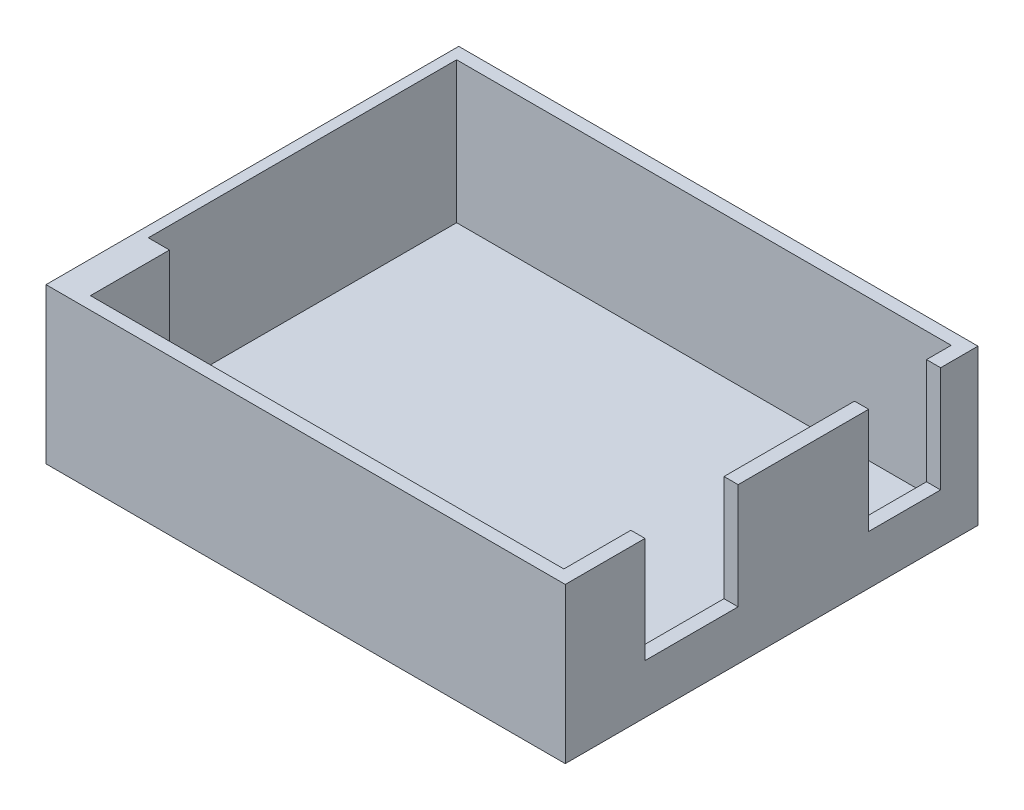
ISO-10303-21;
HEADER;
FILE_DESCRIPTION(('STEP AP214'),'2;1');
FILE_NAME('part.step','',(''),(''),'','','');
FILE_SCHEMA(('AUTOMOTIVE_DESIGN { 1 0 10303 214 1 1 1 1 }'));
ENDSEC;
DATA;
#1=APPLICATION_CONTEXT('core data for automotive mechanical design processes');
#2=APPLICATION_PROTOCOL_DEFINITION('international standard','automotive_design',2000,#1);
#3=PRODUCT_CONTEXT('',#1,'mechanical');
#4=PRODUCT('Part','Part','',(#3));
#5=PRODUCT_RELATED_PRODUCT_CATEGORY('part','',(#4));
#6=PRODUCT_DEFINITION_FORMATION('','',#4);
#7=PRODUCT_DEFINITION_CONTEXT('part definition',#1,'design');
#8=PRODUCT_DEFINITION('design','',#6,#7);
#9=PRODUCT_DEFINITION_SHAPE('','',#8);
#10=(LENGTH_UNIT() NAMED_UNIT(*) SI_UNIT(.MILLI.,.METRE.));
#11=(NAMED_UNIT(*) PLANE_ANGLE_UNIT() SI_UNIT($,.RADIAN.));
#12=(NAMED_UNIT(*) SI_UNIT($,.STERADIAN.) SOLID_ANGLE_UNIT());
#13=UNCERTAINTY_MEASURE_WITH_UNIT(LENGTH_MEASURE(1.E-05),#10,'distance_accuracy_value','');
#14=(GEOMETRIC_REPRESENTATION_CONTEXT(3) GLOBAL_UNCERTAINTY_ASSIGNED_CONTEXT((#13)) GLOBAL_UNIT_ASSIGNED_CONTEXT((#10,
#11,#12)) REPRESENTATION_CONTEXT('',''));
#15=CARTESIAN_POINT('',(0.,0.,0.));
#16=DIRECTION('',(0.,0.,1.));
#17=DIRECTION('',(1.,0.,0.));
#18=AXIS2_PLACEMENT_3D('',#15,#16,#17);
#19=CARTESIAN_POINT('',(0.,2.,0.));
#20=DIRECTION('',(0.,1.,0.));
#21=DIRECTION('',(0.,0.,1.));
#22=AXIS2_PLACEMENT_3D('',#19,#20,#21);
#23=PLANE('',#22);
#24=DIRECTION('',(1.,0.,0.));
#25=VECTOR('',#24,1.);
#26=CARTESIAN_POINT('',(4.5,2.,56.7));
#27=LINE('',#26,#25);
#28=CARTESIAN_POINT('',(4.5,2.,56.7));
#29=VERTEX_POINT('',#28);
#30=CARTESIAN_POINT('',(71.6,2.,56.7));
#31=VERTEX_POINT('',#30);
#32=EDGE_CURVE('E208',#29,#31,#27,.T.);
#33=ORIENTED_EDGE('',*,*,#32,.T.);
#34=DIRECTION('',(0.,0.,-1.));
#35=VECTOR('',#34,1.);
#36=CARTESIAN_POINT('',(71.6,2.,1.8));
#37=LINE('',#36,#35);
#38=CARTESIAN_POINT('',(71.6,2.,1.8));
#39=VERTEX_POINT('',#38);
#40=EDGE_CURVE('E211',#31,#39,#37,.T.);
#41=ORIENTED_EDGE('',*,*,#40,.T.);
#42=DIRECTION('',(-1.,0.,0.));
#43=VECTOR('',#42,1.);
#44=CARTESIAN_POINT('',(1.5,2.,1.8));
#45=LINE('',#44,#43);
#46=CARTESIAN_POINT('',(1.5,2.,1.8));
#47=VERTEX_POINT('',#46);
#48=EDGE_CURVE('E214',#39,#47,#45,.T.);
#49=ORIENTED_EDGE('',*,*,#48,.T.);
#50=DIRECTION('',(0.,0.,1.));
#51=VECTOR('',#50,1.);
#52=CARTESIAN_POINT('',(1.5,2.,1.8));
#53=LINE('',#52,#51);
#54=CARTESIAN_POINT('',(1.50000000000001,2.,45.5));
#55=VERTEX_POINT('',#54);
#56=EDGE_CURVE('E198',#47,#55,#53,.T.);
#57=ORIENTED_EDGE('',*,*,#56,.T.);
#58=DIRECTION('',(1.,0.,0.));
#59=VECTOR('',#58,1.);
#60=CARTESIAN_POINT('',(1.50000000000001,2.,45.5));
#61=LINE('',#60,#59);
#62=CARTESIAN_POINT('',(4.5,2.,45.5));
#63=VERTEX_POINT('',#62);
#64=EDGE_CURVE('E201',#55,#63,#61,.T.);
#65=ORIENTED_EDGE('',*,*,#64,.T.);
#66=DIRECTION('',(0.,0.,1.));
#67=VECTOR('',#66,1.);
#68=CARTESIAN_POINT('',(4.5,2.,45.5));
#69=LINE('',#68,#67);
#70=EDGE_CURVE('E205',#63,#29,#69,.T.);
#71=ORIENTED_EDGE('',*,*,#70,.T.);
#72=EDGE_LOOP('',(#33,#41,#49,#57,#65,#71));
#73=FACE_BOUND('',#72,.T.);
#74=ADVANCED_FACE('F35',(#73),#23,.T.);
#75=CARTESIAN_POINT('',(0.,22.,0.));
#76=DIRECTION('',(0.,1.,0.));
#77=DIRECTION('',(0.,0.,1.));
#78=AXIS2_PLACEMENT_3D('',#75,#76,#77);
#79=PLANE('',#78);
#80=DIRECTION('',(1.,0.,0.));
#81=VECTOR('',#80,1.);
#82=CARTESIAN_POINT('',(71.6,22.,15.5));
#83=LINE('',#82,#81);
#84=CARTESIAN_POINT('',(71.6,22.,15.5));
#85=VERTEX_POINT('',#84);
#86=CARTESIAN_POINT('',(73.6,22.,15.5));
#87=VERTEX_POINT('',#86);
#88=EDGE_CURVE('E236',#85,#87,#83,.T.);
#89=ORIENTED_EDGE('',*,*,#88,.F.);
#90=DIRECTION('',(0.,0.,-1.));
#91=VECTOR('',#90,1.);
#92=CARTESIAN_POINT('',(71.6,22.,15.5));
#93=LINE('',#92,#91);
#94=CARTESIAN_POINT('',(71.6,22.,34.));
#95=VERTEX_POINT('',#94);
#96=EDGE_CURVE('E233',#95,#85,#93,.T.);
#97=ORIENTED_EDGE('',*,*,#96,.F.);
#98=DIRECTION('',(-1.,0.,0.));
#99=VECTOR('',#98,1.);
#100=CARTESIAN_POINT('',(71.6,22.,34.));
#101=LINE('',#100,#99);
#102=CARTESIAN_POINT('',(73.6,22.,34.));
#103=VERTEX_POINT('',#102);
#104=EDGE_CURVE('E231',#103,#95,#101,.T.);
#105=ORIENTED_EDGE('',*,*,#104,.F.);
#106=DIRECTION('',(0.,0.,-1.));
#107=VECTOR('',#106,1.);
#108=CARTESIAN_POINT('',(73.6,22.,0.));
#109=LINE('',#108,#107);
#110=EDGE_CURVE('E281',#103,#87,#109,.T.);
#111=ORIENTED_EDGE('',*,*,#110,.T.);
#112=EDGE_LOOP('',(#89,#97,#105,#111));
#113=FACE_BOUND('',#112,.T.);
#114=ADVANCED_FACE('F325',(#113),#79,.T.);
#115=CARTESIAN_POINT('',(0.,22.,0.));
#116=DIRECTION('',(1.,0.,0.));
#117=DIRECTION('',(0.,0.,-1.));
#118=AXIS2_PLACEMENT_3D('',#115,#116,#117);
#119=PLANE('',#118);
#120=DIRECTION('',(0.,0.,1.));
#121=VECTOR('',#120,1.);
#122=CARTESIAN_POINT('',(0.,0.,0.));
#123=LINE('',#122,#121);
#124=CARTESIAN_POINT('',(0.,0.,0.));
#125=VERTEX_POINT('',#124);
#126=CARTESIAN_POINT('',(0.,0.,58.5));
#127=VERTEX_POINT('',#126);
#128=EDGE_CURVE('E248',#125,#127,#123,.T.);
#129=ORIENTED_EDGE('',*,*,#128,.T.);
#130=DIRECTION('',(0.,-1.,0.));
#131=VECTOR('',#130,1.);
#132=CARTESIAN_POINT('',(0.,22.,58.5));
#133=LINE('',#132,#131);
#134=CARTESIAN_POINT('',(0.,22.,58.5));
#135=VERTEX_POINT('',#134);
#136=EDGE_CURVE('E11',#135,#127,#133,.T.);
#137=ORIENTED_EDGE('',*,*,#136,.F.);
#138=DIRECTION('',(0.,0.,1.));
#139=VECTOR('',#138,1.);
#140=CARTESIAN_POINT('',(0.,22.,0.));
#141=LINE('',#140,#139);
#142=CARTESIAN_POINT('',(0.,22.,0.));
#143=VERTEX_POINT('',#142);
#144=EDGE_CURVE('E270',#143,#135,#141,.T.);
#145=ORIENTED_EDGE('',*,*,#144,.F.);
#146=DIRECTION('',(0.,-1.,0.));
#147=VECTOR('',#146,1.);
#148=CARTESIAN_POINT('',(0.,22.,0.));
#149=LINE('',#148,#147);
#150=EDGE_CURVE('E283',#143,#125,#149,.T.);
#151=ORIENTED_EDGE('',*,*,#150,.T.);
#152=EDGE_LOOP('',(#129,#137,#145,#151));
#153=FACE_BOUND('',#152,.T.);
#154=ADVANCED_FACE('F37',(#153),#119,.F.);
#155=CARTESIAN_POINT('',(0.,22.,58.5));
#156=DIRECTION('',(0.,0.,-1.));
#157=DIRECTION('',(-1.,0.,0.));
#158=AXIS2_PLACEMENT_3D('',#155,#156,#157);
#159=PLANE('',#158);
#160=DIRECTION('',(1.,0.,0.));
#161=VECTOR('',#160,1.);
#162=CARTESIAN_POINT('',(0.,0.,58.5));
#163=LINE('',#162,#161);
#164=CARTESIAN_POINT('',(73.6,0.,58.5));
#165=VERTEX_POINT('',#164);
#166=EDGE_CURVE('E286',#127,#165,#163,.T.);
#167=ORIENTED_EDGE('',*,*,#166,.T.);
#168=DIRECTION('',(0.,-1.,0.));
#169=VECTOR('',#168,1.);
#170=CARTESIAN_POINT('',(73.6,22.,58.5));
#171=LINE('',#170,#169);
#172=CARTESIAN_POINT('',(73.6,22.,58.5));
#173=VERTEX_POINT('',#172);
#174=EDGE_CURVE('E43',#173,#165,#171,.T.);
#175=ORIENTED_EDGE('',*,*,#174,.F.);
#176=DIRECTION('',(1.,0.,0.));
#177=VECTOR('',#176,1.);
#178=CARTESIAN_POINT('',(0.,22.,58.5));
#179=LINE('',#178,#177);
#180=EDGE_CURVE('E273',#135,#173,#179,.T.);
#181=ORIENTED_EDGE('',*,*,#180,.F.);
#182=ORIENTED_EDGE('',*,*,#136,.T.);
#183=EDGE_LOOP('',(#167,#175,#181,#182));
#184=FACE_BOUND('',#183,.T.);
#185=ADVANCED_FACE('F391',(#184),#159,.F.);
#186=CARTESIAN_POINT('',(73.6,22.,0.));
#187=DIRECTION('',(-1.,0.,0.));
#188=DIRECTION('',(0.,0.,1.));
#189=AXIS2_PLACEMENT_3D('',#186,#187,#188);
#190=PLANE('',#189);
#191=DIRECTION('',(0.,1.,0.));
#192=VECTOR('',#191,1.);
#193=CARTESIAN_POINT('',(73.6,2.,34.));
#194=LINE('',#193,#192);
#195=CARTESIAN_POINT('',(73.6,7.,34.));
#196=VERTEX_POINT('',#195);
#197=EDGE_CURVE('E260',#196,#103,#194,.T.);
#198=ORIENTED_EDGE('',*,*,#197,.F.);
#199=DIRECTION('',(0.,0.,-1.));
#200=VECTOR('',#199,1.);
#201=CARTESIAN_POINT('',(73.6,7.,34.));
#202=LINE('',#201,#200);
#203=CARTESIAN_POINT('',(73.6,7.,47.2));
#204=VERTEX_POINT('',#203);
#205=EDGE_CURVE('E178',#204,#196,#202,.T.);
#206=ORIENTED_EDGE('',*,*,#205,.F.);
#207=DIRECTION('',(0.,1.,0.));
#208=VECTOR('',#207,1.);
#209=CARTESIAN_POINT('',(73.6,2.,47.2));
#210=LINE('',#209,#208);
#211=CARTESIAN_POINT('',(73.6,22.,47.2));
#212=VERTEX_POINT('',#211);
#213=EDGE_CURVE('E169',#204,#212,#210,.T.);
#214=ORIENTED_EDGE('',*,*,#213,.T.);
#215=EDGE_CURVE('E277',#173,#212,#109,.T.);
#216=ORIENTED_EDGE('',*,*,#215,.F.);
#217=ORIENTED_EDGE('',*,*,#174,.T.);
#218=DIRECTION('',(0.,0.,-1.));
#219=VECTOR('',#218,1.);
#220=CARTESIAN_POINT('',(73.6,0.,0.));
#221=LINE('',#220,#219);
#222=CARTESIAN_POINT('',(73.6,0.,0.));
#223=VERTEX_POINT('',#222);
#224=EDGE_CURVE('E288',#165,#223,#221,.T.);
#225=ORIENTED_EDGE('',*,*,#224,.T.);
#226=DIRECTION('',(0.,-1.,0.));
#227=VECTOR('',#226,1.);
#228=CARTESIAN_POINT('',(73.6,22.,0.));
#229=LINE('',#228,#227);
#230=CARTESIAN_POINT('',(73.6,22.,0.));
#231=VERTEX_POINT('',#230);
#232=EDGE_CURVE('E293',#231,#223,#229,.T.);
#233=ORIENTED_EDGE('',*,*,#232,.F.);
#234=CARTESIAN_POINT('',(73.6,22.,5.3));
#235=VERTEX_POINT('',#234);
#236=EDGE_CURVE('E276',#235,#231,#109,.T.);
#237=ORIENTED_EDGE('',*,*,#236,.F.);
#238=DIRECTION('',(0.,1.,0.));
#239=VECTOR('',#238,1.);
#240=CARTESIAN_POINT('',(73.6,2.,5.3));
#241=LINE('',#240,#239);
#242=CARTESIAN_POINT('',(73.6,7.,5.3));
#243=VERTEX_POINT('',#242);
#244=EDGE_CURVE('E253',#243,#235,#241,.T.);
#245=ORIENTED_EDGE('',*,*,#244,.F.);
#246=DIRECTION('',(0.,0.,-1.));
#247=VECTOR('',#246,1.);
#248=CARTESIAN_POINT('',(73.6,7.,5.3));
#249=LINE('',#248,#247);
#250=CARTESIAN_POINT('',(73.6,7.,15.5));
#251=VERTEX_POINT('',#250);
#252=EDGE_CURVE('E191',#251,#243,#249,.T.);
#253=ORIENTED_EDGE('',*,*,#252,.F.);
#254=DIRECTION('',(0.,1.,0.));
#255=VECTOR('',#254,1.);
#256=CARTESIAN_POINT('',(73.6,2.,15.5));
#257=LINE('',#256,#255);
#258=EDGE_CURVE('E255',#251,#87,#257,.T.);
#259=ORIENTED_EDGE('',*,*,#258,.T.);
#260=ORIENTED_EDGE('',*,*,#110,.F.);
#261=EDGE_LOOP('',(#198,#206,#214,#216,#217,#225,#233,#237,#245,#253,#259,#260));
#262=FACE_BOUND('',#261,.T.);
#263=ADVANCED_FACE('F300',(#262),#190,.F.);
#264=CARTESIAN_POINT('',(0.,22.,0.));
#265=DIRECTION('',(0.,0.,1.));
#266=DIRECTION('',(1.,0.,0.));
#267=AXIS2_PLACEMENT_3D('',#264,#265,#266);
#268=PLANE('',#267);
#269=DIRECTION('',(-1.,0.,0.));
#270=VECTOR('',#269,1.);
#271=CARTESIAN_POINT('',(0.,0.,0.));
#272=LINE('',#271,#270);
#273=EDGE_CURVE('E274',#223,#125,#272,.T.);
#274=ORIENTED_EDGE('',*,*,#273,.T.);
#275=ORIENTED_EDGE('',*,*,#150,.F.);
#276=DIRECTION('',(-1.,0.,0.));
#277=VECTOR('',#276,1.);
#278=CARTESIAN_POINT('',(0.,22.,0.));
#279=LINE('',#278,#277);
#280=EDGE_CURVE('E280',#231,#143,#279,.T.);
#281=ORIENTED_EDGE('',*,*,#280,.F.);
#282=ORIENTED_EDGE('',*,*,#232,.T.);
#283=EDGE_LOOP('',(#274,#275,#281,#282));
#284=FACE_BOUND('',#283,.T.);
#285=ADVANCED_FACE('F309',(#284),#268,.F.);
#286=DIRECTION('',(-1.,0.,0.));
#287=VECTOR('',#286,1.);
#288=CARTESIAN_POINT('',(71.6,22.,5.3));
#289=LINE('',#288,#287);
#290=CARTESIAN_POINT('',(71.6,22.,5.3));
#291=VERTEX_POINT('',#290);
#292=EDGE_CURVE('E239',#235,#291,#289,.T.);
#293=ORIENTED_EDGE('',*,*,#292,.F.);
#294=ORIENTED_EDGE('',*,*,#236,.T.);
#295=ORIENTED_EDGE('',*,*,#280,.T.);
#296=ORIENTED_EDGE('',*,*,#144,.T.);
#297=ORIENTED_EDGE('',*,*,#180,.T.);
#298=ORIENTED_EDGE('',*,*,#215,.T.);
#299=DIRECTION('',(1.,0.,0.));
#300=VECTOR('',#299,1.);
#301=CARTESIAN_POINT('',(71.6,22.,47.2));
#302=LINE('',#301,#300);
#303=CARTESIAN_POINT('',(71.6,22.,47.2));
#304=VERTEX_POINT('',#303);
#305=EDGE_CURVE('E229',#304,#212,#302,.T.);
#306=ORIENTED_EDGE('',*,*,#305,.F.);
#307=DIRECTION('',(0.,0.,-1.));
#308=VECTOR('',#307,1.);
#309=CARTESIAN_POINT('',(71.6,22.,56.7));
#310=LINE('',#309,#308);
#311=CARTESIAN_POINT('',(71.6,22.,56.7));
#312=VERTEX_POINT('',#311);
#313=EDGE_CURVE('E165',#312,#304,#310,.T.);
#314=ORIENTED_EDGE('',*,*,#313,.F.);
#315=DIRECTION('',(1.,0.,0.));
#316=VECTOR('',#315,1.);
#317=CARTESIAN_POINT('',(4.5,22.,56.7));
#318=LINE('',#317,#316);
#319=CARTESIAN_POINT('',(4.5,22.,56.7));
#320=VERTEX_POINT('',#319);
#321=EDGE_CURVE('E225',#320,#312,#318,.T.);
#322=ORIENTED_EDGE('',*,*,#321,.F.);
#323=DIRECTION('',(0.,0.,1.));
#324=VECTOR('',#323,1.);
#325=CARTESIAN_POINT('',(4.5,22.,45.5));
#326=LINE('',#325,#324);
#327=CARTESIAN_POINT('',(4.5,22.,45.5));
#328=VERTEX_POINT('',#327);
#329=EDGE_CURVE('E222',#328,#320,#326,.T.);
#330=ORIENTED_EDGE('',*,*,#329,.F.);
#331=DIRECTION('',(1.,0.,0.));
#332=VECTOR('',#331,1.);
#333=CARTESIAN_POINT('',(1.50000000000001,22.,45.5));
#334=LINE('',#333,#332);
#335=CARTESIAN_POINT('',(1.50000000000001,22.,45.5));
#336=VERTEX_POINT('',#335);
#337=EDGE_CURVE('E219',#336,#328,#334,.T.);
#338=ORIENTED_EDGE('',*,*,#337,.F.);
#339=DIRECTION('',(0.,0.,1.));
#340=VECTOR('',#339,1.);
#341=CARTESIAN_POINT('',(1.5,22.,1.8));
#342=LINE('',#341,#340);
#343=CARTESIAN_POINT('',(1.5,22.,1.8));
#344=VERTEX_POINT('',#343);
#345=EDGE_CURVE('E197',#344,#336,#342,.T.);
#346=ORIENTED_EDGE('',*,*,#345,.F.);
#347=DIRECTION('',(-1.,0.,0.));
#348=VECTOR('',#347,1.);
#349=CARTESIAN_POINT('',(1.5,22.,1.8));
#350=LINE('',#349,#348);
#351=CARTESIAN_POINT('',(71.6,22.,1.8));
#352=VERTEX_POINT('',#351);
#353=EDGE_CURVE('E202',#352,#344,#350,.T.);
#354=ORIENTED_EDGE('',*,*,#353,.F.);
#355=DIRECTION('',(0.,0.,-1.));
#356=VECTOR('',#355,1.);
#357=CARTESIAN_POINT('',(71.6,22.,1.8));
#358=LINE('',#357,#356);
#359=EDGE_CURVE('E242',#291,#352,#358,.T.);
#360=ORIENTED_EDGE('',*,*,#359,.F.);
#361=EDGE_LOOP('',(#293,#294,#295,#296,#297,#298,#306,#314,#322,#330,#338,#346,#354,#360));
#362=FACE_BOUND('',#361,.T.);
#363=ADVANCED_FACE('F316',(#362),#79,.T.);
#364=CARTESIAN_POINT('',(0.,0.,0.));
#365=DIRECTION('',(0.,1.,0.));
#366=DIRECTION('',(0.,0.,1.));
#367=AXIS2_PLACEMENT_3D('',#364,#365,#366);
#368=PLANE('',#367);
#369=ORIENTED_EDGE('',*,*,#128,.F.);
#370=ORIENTED_EDGE('',*,*,#273,.F.);
#371=ORIENTED_EDGE('',*,*,#224,.F.);
#372=ORIENTED_EDGE('',*,*,#166,.F.);
#373=EDGE_LOOP('',(#369,#370,#371,#372));
#374=FACE_BOUND('',#373,.T.);
#375=ADVANCED_FACE('F306',(#374),#368,.F.);
#376=CARTESIAN_POINT('',(1.5,2.,1.8));
#377=DIRECTION('',(-1.,0.,0.));
#378=DIRECTION('',(0.,0.,1.));
#379=AXIS2_PLACEMENT_3D('',#376,#377,#378);
#380=PLANE('',#379);
#381=ORIENTED_EDGE('',*,*,#345,.T.);
#382=DIRECTION('',(0.,1.,0.));
#383=VECTOR('',#382,1.);
#384=CARTESIAN_POINT('',(1.50000000000001,2.,45.5));
#385=LINE('',#384,#383);
#386=EDGE_CURVE('E217',#55,#336,#385,.T.);
#387=ORIENTED_EDGE('',*,*,#386,.F.);
#388=ORIENTED_EDGE('',*,*,#56,.F.);
#389=DIRECTION('',(0.,1.,0.));
#390=VECTOR('',#389,1.);
#391=CARTESIAN_POINT('',(1.5,2.,1.8));
#392=LINE('',#391,#390);
#393=EDGE_CURVE('E246',#47,#344,#392,.T.);
#394=ORIENTED_EDGE('',*,*,#393,.T.);
#395=EDGE_LOOP('',(#381,#387,#388,#394));
#396=FACE_BOUND('',#395,.T.);
#397=ADVANCED_FACE('F357',(#396),#380,.F.);
#398=CARTESIAN_POINT('',(1.5,2.,1.8));
#399=DIRECTION('',(0.,0.,-1.));
#400=DIRECTION('',(-1.,0.,0.));
#401=AXIS2_PLACEMENT_3D('',#398,#399,#400);
#402=PLANE('',#401);
#403=ORIENTED_EDGE('',*,*,#353,.T.);
#404=ORIENTED_EDGE('',*,*,#393,.F.);
#405=ORIENTED_EDGE('',*,*,#48,.F.);
#406=DIRECTION('',(0.,1.,0.));
#407=VECTOR('',#406,1.);
#408=CARTESIAN_POINT('',(71.6,2.,1.8));
#409=LINE('',#408,#407);
#410=EDGE_CURVE('E249',#39,#352,#409,.T.);
#411=ORIENTED_EDGE('',*,*,#410,.T.);
#412=EDGE_LOOP('',(#403,#404,#405,#411));
#413=FACE_BOUND('',#412,.T.);
#414=ADVANCED_FACE('F354',(#413),#402,.F.);
#415=CARTESIAN_POINT('',(71.6,2.,1.8));
#416=DIRECTION('',(1.,0.,0.));
#417=DIRECTION('',(0.,0.,-1.));
#418=AXIS2_PLACEMENT_3D('',#415,#416,#417);
#419=PLANE('',#418);
#420=ORIENTED_EDGE('',*,*,#359,.T.);
#421=ORIENTED_EDGE('',*,*,#410,.F.);
#422=ORIENTED_EDGE('',*,*,#40,.F.);
#423=DIRECTION('',(0.,1.,0.));
#424=VECTOR('',#423,1.);
#425=CARTESIAN_POINT('',(71.6,2.,56.7));
#426=LINE('',#425,#424);
#427=EDGE_CURVE('E170',#31,#312,#426,.T.);
#428=ORIENTED_EDGE('',*,*,#427,.T.);
#429=ORIENTED_EDGE('',*,*,#313,.T.);
#430=DIRECTION('',(0.,1.,0.));
#431=VECTOR('',#430,1.);
#432=CARTESIAN_POINT('',(71.6,2.,47.2));
#433=LINE('',#432,#431);
#434=CARTESIAN_POINT('',(71.6,7.,47.2));
#435=VERTEX_POINT('',#434);
#436=EDGE_CURVE('E158',#435,#304,#433,.T.);
#437=ORIENTED_EDGE('',*,*,#436,.F.);
#438=DIRECTION('',(0.,0.,1.));
#439=VECTOR('',#438,1.);
#440=CARTESIAN_POINT('',(71.6,7.,34.));
#441=LINE('',#440,#439);
#442=CARTESIAN_POINT('',(71.6,7.,34.));
#443=VERTEX_POINT('',#442);
#444=EDGE_CURVE('E163',#443,#435,#441,.T.);
#445=ORIENTED_EDGE('',*,*,#444,.F.);
#446=DIRECTION('',(0.,1.,0.));
#447=VECTOR('',#446,1.);
#448=CARTESIAN_POINT('',(71.6,2.,34.));
#449=LINE('',#448,#447);
#450=EDGE_CURVE('E55',#443,#95,#449,.T.);
#451=ORIENTED_EDGE('',*,*,#450,.T.);
#452=ORIENTED_EDGE('',*,*,#96,.T.);
#453=DIRECTION('',(0.,1.,0.));
#454=VECTOR('',#453,1.);
#455=CARTESIAN_POINT('',(71.6,2.,15.5));
#456=LINE('',#455,#454);
#457=CARTESIAN_POINT('',(71.6,7.,15.5));
#458=VERTEX_POINT('',#457);
#459=EDGE_CURVE('E257',#458,#85,#456,.T.);
#460=ORIENTED_EDGE('',*,*,#459,.F.);
#461=DIRECTION('',(0.,0.,1.));
#462=VECTOR('',#461,1.);
#463=CARTESIAN_POINT('',(71.6,7.,5.3));
#464=LINE('',#463,#462);
#465=CARTESIAN_POINT('',(71.6,7.,5.3));
#466=VERTEX_POINT('',#465);
#467=EDGE_CURVE('E185',#466,#458,#464,.T.);
#468=ORIENTED_EDGE('',*,*,#467,.F.);
#469=DIRECTION('',(0.,1.,0.));
#470=VECTOR('',#469,1.);
#471=CARTESIAN_POINT('',(71.6,2.,5.3));
#472=LINE('',#471,#470);
#473=EDGE_CURVE('E251',#466,#291,#472,.T.);
#474=ORIENTED_EDGE('',*,*,#473,.T.);
#475=EDGE_LOOP('',(#420,#421,#422,#428,#429,#437,#445,#451,#452,#460,#468,#474));
#476=FACE_BOUND('',#475,.T.);
#477=ADVANCED_FACE('F161',(#476),#419,.F.);
#478=CARTESIAN_POINT('',(71.6,2.,5.3));
#479=DIRECTION('',(0.,0.,-1.));
#480=DIRECTION('',(-1.,0.,0.));
#481=AXIS2_PLACEMENT_3D('',#478,#479,#480);
#482=PLANE('',#481);
#483=ORIENTED_EDGE('',*,*,#473,.F.);
#484=DIRECTION('',(-1.,0.,0.));
#485=VECTOR('',#484,1.);
#486=CARTESIAN_POINT('',(71.6,7.,5.3));
#487=LINE('',#486,#485);
#488=EDGE_CURVE('E194',#243,#466,#487,.T.);
#489=ORIENTED_EDGE('',*,*,#488,.F.);
#490=ORIENTED_EDGE('',*,*,#244,.T.);
#491=ORIENTED_EDGE('',*,*,#292,.T.);
#492=EDGE_LOOP('',(#483,#489,#490,#491));
#493=FACE_BOUND('',#492,.T.);
#494=ADVANCED_FACE('F341',(#493),#482,.F.);
#495=CARTESIAN_POINT('',(71.6,2.,15.5));
#496=DIRECTION('',(0.,0.,1.));
#497=DIRECTION('',(1.,0.,0.));
#498=AXIS2_PLACEMENT_3D('',#495,#496,#497);
#499=PLANE('',#498);
#500=ORIENTED_EDGE('',*,*,#258,.F.);
#501=DIRECTION('',(1.,0.,0.));
#502=VECTOR('',#501,1.);
#503=CARTESIAN_POINT('',(71.6,7.,15.5));
#504=LINE('',#503,#502);
#505=EDGE_CURVE('E188',#458,#251,#504,.T.);
#506=ORIENTED_EDGE('',*,*,#505,.F.);
#507=ORIENTED_EDGE('',*,*,#459,.T.);
#508=ORIENTED_EDGE('',*,*,#88,.T.);
#509=EDGE_LOOP('',(#500,#506,#507,#508));
#510=FACE_BOUND('',#509,.T.);
#511=ADVANCED_FACE('F329',(#510),#499,.F.);
#512=CARTESIAN_POINT('',(71.6,2.,34.));
#513=DIRECTION('',(0.,0.,-1.));
#514=DIRECTION('',(-1.,0.,0.));
#515=AXIS2_PLACEMENT_3D('',#512,#513,#514);
#516=PLANE('',#515);
#517=ORIENTED_EDGE('',*,*,#450,.F.);
#518=DIRECTION('',(-1.,0.,0.));
#519=VECTOR('',#518,1.);
#520=CARTESIAN_POINT('',(71.6,7.,34.));
#521=LINE('',#520,#519);
#522=EDGE_CURVE('E50',#196,#443,#521,.T.);
#523=ORIENTED_EDGE('',*,*,#522,.F.);
#524=ORIENTED_EDGE('',*,*,#197,.T.);
#525=ORIENTED_EDGE('',*,*,#104,.T.);
#526=EDGE_LOOP('',(#517,#523,#524,#525));
#527=FACE_BOUND('',#526,.T.);
#528=ADVANCED_FACE('F332',(#527),#516,.F.);
#529=CARTESIAN_POINT('',(71.6,2.,47.2));
#530=DIRECTION('',(0.,0.,1.));
#531=DIRECTION('',(1.,0.,0.));
#532=AXIS2_PLACEMENT_3D('',#529,#530,#531);
#533=PLANE('',#532);
#534=ORIENTED_EDGE('',*,*,#213,.F.);
#535=DIRECTION('',(1.,0.,0.));
#536=VECTOR('',#535,1.);
#537=CARTESIAN_POINT('',(71.6,7.,47.2));
#538=LINE('',#537,#536);
#539=EDGE_CURVE('E173',#435,#204,#538,.T.);
#540=ORIENTED_EDGE('',*,*,#539,.F.);
#541=ORIENTED_EDGE('',*,*,#436,.T.);
#542=ORIENTED_EDGE('',*,*,#305,.T.);
#543=EDGE_LOOP('',(#534,#540,#541,#542));
#544=FACE_BOUND('',#543,.T.);
#545=ADVANCED_FACE('F174',(#544),#533,.F.);
#546=CARTESIAN_POINT('',(4.5,2.,56.7));
#547=DIRECTION('',(0.,0.,1.));
#548=DIRECTION('',(1.,0.,0.));
#549=AXIS2_PLACEMENT_3D('',#546,#547,#548);
#550=PLANE('',#549);
#551=ORIENTED_EDGE('',*,*,#321,.T.);
#552=ORIENTED_EDGE('',*,*,#427,.F.);
#553=ORIENTED_EDGE('',*,*,#32,.F.);
#554=DIRECTION('',(0.,1.,0.));
#555=VECTOR('',#554,1.);
#556=CARTESIAN_POINT('',(4.5,2.,56.7));
#557=LINE('',#556,#555);
#558=EDGE_CURVE('E264',#29,#320,#557,.T.);
#559=ORIENTED_EDGE('',*,*,#558,.T.);
#560=EDGE_LOOP('',(#551,#552,#553,#559));
#561=FACE_BOUND('',#560,.T.);
#562=ADVANCED_FACE('F339',(#561),#550,.F.);
#563=CARTESIAN_POINT('',(4.5,2.,45.5));
#564=DIRECTION('',(-1.,0.,0.));
#565=DIRECTION('',(0.,0.,1.));
#566=AXIS2_PLACEMENT_3D('',#563,#564,#565);
#567=PLANE('',#566);
#568=ORIENTED_EDGE('',*,*,#329,.T.);
#569=ORIENTED_EDGE('',*,*,#558,.F.);
#570=ORIENTED_EDGE('',*,*,#70,.F.);
#571=DIRECTION('',(0.,1.,0.));
#572=VECTOR('',#571,1.);
#573=CARTESIAN_POINT('',(4.5,2.,45.5));
#574=LINE('',#573,#572);
#575=EDGE_CURVE('E266',#63,#328,#574,.T.);
#576=ORIENTED_EDGE('',*,*,#575,.T.);
#577=EDGE_LOOP('',(#568,#569,#570,#576));
#578=FACE_BOUND('',#577,.T.);
#579=ADVANCED_FACE('F372',(#578),#567,.F.);
#580=CARTESIAN_POINT('',(1.50000000000001,2.,45.5));
#581=DIRECTION('',(0.,0.,1.));
#582=DIRECTION('',(1.,0.,0.));
#583=AXIS2_PLACEMENT_3D('',#580,#581,#582);
#584=PLANE('',#583);
#585=ORIENTED_EDGE('',*,*,#337,.T.);
#586=ORIENTED_EDGE('',*,*,#575,.F.);
#587=ORIENTED_EDGE('',*,*,#64,.F.);
#588=ORIENTED_EDGE('',*,*,#386,.T.);
#589=EDGE_LOOP('',(#585,#586,#587,#588));
#590=FACE_BOUND('',#589,.T.);
#591=ADVANCED_FACE('F367',(#590),#584,.F.);
#592=CARTESIAN_POINT('',(0.,7.,0.));
#593=DIRECTION('',(0.,1.,0.));
#594=DIRECTION('',(0.,0.,1.));
#595=AXIS2_PLACEMENT_3D('',#592,#593,#594);
#596=PLANE('',#595);
#597=ORIENTED_EDGE('',*,*,#467,.T.);
#598=ORIENTED_EDGE('',*,*,#505,.T.);
#599=ORIENTED_EDGE('',*,*,#252,.T.);
#600=ORIENTED_EDGE('',*,*,#488,.T.);
#601=EDGE_LOOP('',(#597,#598,#599,#600));
#602=FACE_BOUND('',#601,.T.);
#603=ADVANCED_FACE('F352',(#602),#596,.T.);
#604=CARTESIAN_POINT('',(0.,7.,0.));
#605=DIRECTION('',(0.,1.,0.));
#606=DIRECTION('',(0.,0.,1.));
#607=AXIS2_PLACEMENT_3D('',#604,#605,#606);
#608=PLANE('',#607);
#609=ORIENTED_EDGE('',*,*,#444,.T.);
#610=ORIENTED_EDGE('',*,*,#539,.T.);
#611=ORIENTED_EDGE('',*,*,#205,.T.);
#612=ORIENTED_EDGE('',*,*,#522,.T.);
#613=EDGE_LOOP('',(#609,#610,#611,#612));
#614=FACE_BOUND('',#613,.T.);
#615=ADVANCED_FACE('F180',(#614),#608,.T.);
#616=CLOSED_SHELL('',(#74,#114,#154,#185,#263,#285,#363,#375,#397,#414,#477,#494,#511,#528,#545,
#562,#579,#591,#603,#615));
#617=MANIFOLD_SOLID_BREP('B2',#616);
#618=ADVANCED_BREP_SHAPE_REPRESENTATION('',(#18,#617),#14);
#619=SHAPE_DEFINITION_REPRESENTATION(#9,#618);
ENDSEC;
END-ISO-10303-21;
